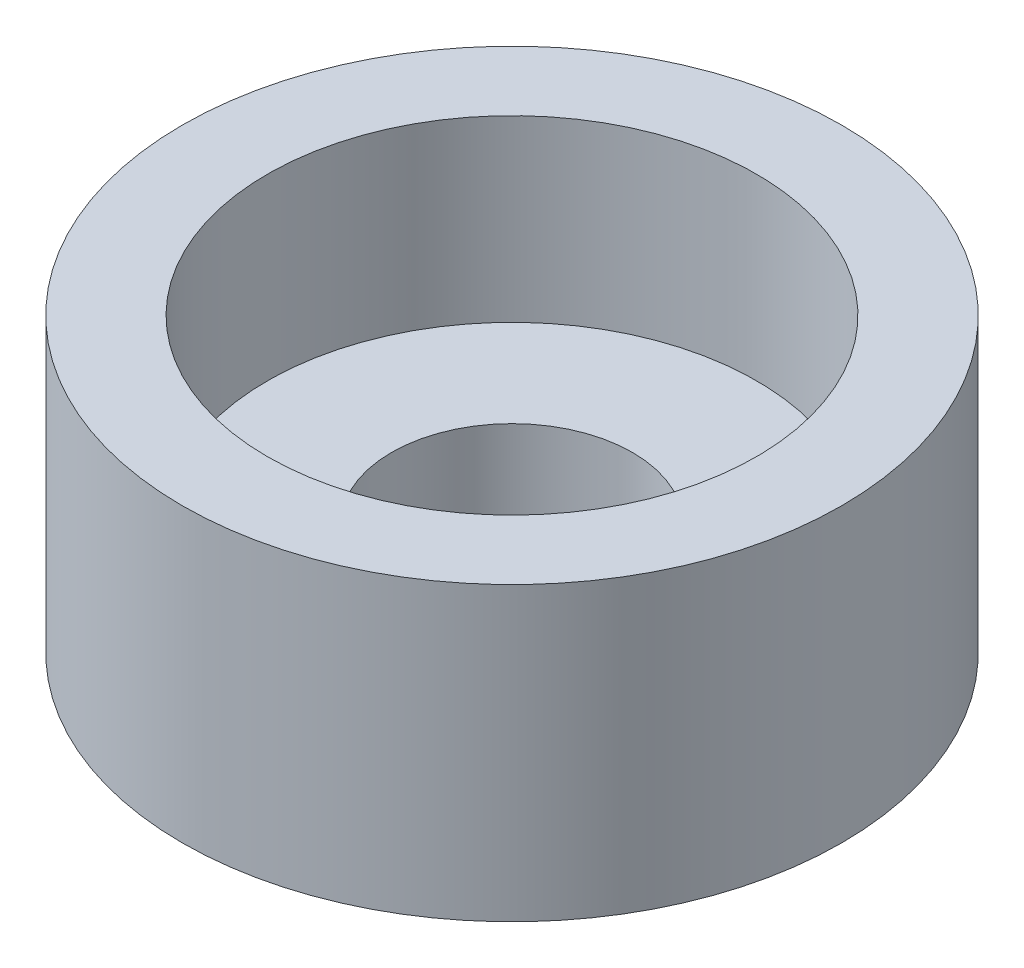
ISO-10303-21;
HEADER;
FILE_DESCRIPTION(('STEP AP214'),'2;1');
FILE_NAME('part.step','',(''),(''),'','','');
FILE_SCHEMA(('AUTOMOTIVE_DESIGN { 1 0 10303 214 1 1 1 1 }'));
ENDSEC;
DATA;
#1=APPLICATION_CONTEXT('core data for automotive mechanical design processes');
#2=APPLICATION_PROTOCOL_DEFINITION('international standard','automotive_design',2000,#1);
#3=PRODUCT_CONTEXT('',#1,'mechanical');
#4=PRODUCT('Part','Part','',(#3));
#5=PRODUCT_RELATED_PRODUCT_CATEGORY('part','',(#4));
#6=PRODUCT_DEFINITION_FORMATION('','',#4);
#7=PRODUCT_DEFINITION_CONTEXT('part definition',#1,'design');
#8=PRODUCT_DEFINITION('design','',#6,#7);
#9=PRODUCT_DEFINITION_SHAPE('','',#8);
#10=(LENGTH_UNIT() NAMED_UNIT(*) SI_UNIT(.MILLI.,.METRE.));
#11=(NAMED_UNIT(*) PLANE_ANGLE_UNIT() SI_UNIT($,.RADIAN.));
#12=(NAMED_UNIT(*) SI_UNIT($,.STERADIAN.) SOLID_ANGLE_UNIT());
#13=UNCERTAINTY_MEASURE_WITH_UNIT(LENGTH_MEASURE(1.E-05),#10,'distance_accuracy_value','');
#14=(GEOMETRIC_REPRESENTATION_CONTEXT(3) GLOBAL_UNCERTAINTY_ASSIGNED_CONTEXT((#13)) GLOBAL_UNIT_ASSIGNED_CONTEXT((#10,
#11,#12)) REPRESENTATION_CONTEXT('',''));
#15=CARTESIAN_POINT('',(0.,0.,0.));
#16=DIRECTION('',(0.,0.,1.));
#17=DIRECTION('',(1.,0.,0.));
#18=AXIS2_PLACEMENT_3D('',#15,#16,#17);
#19=CARTESIAN_POINT('',(0.,31.,0.));
#20=DIRECTION('',(0.,-1.,0.));
#21=DIRECTION('',(0.,0.,-1.));
#22=AXIS2_PLACEMENT_3D('',#19,#20,#21);
#23=CYLINDRICAL_SURFACE('',#22,12.8);
#24=CARTESIAN_POINT('',(0.,0.,0.));
#25=DIRECTION('',(0.,1.,0.));
#26=DIRECTION('',(0.,0.,1.));
#27=AXIS2_PLACEMENT_3D('',#24,#25,#26);
#28=CIRCLE('',#27,12.8);
#29=CARTESIAN_POINT('',(0.,0.,12.8));
#30=VERTEX_POINT('',#29);
#31=EDGE_CURVE('E58',#30,#30,#28,.T.);
#32=ORIENTED_EDGE('',*,*,#31,.F.);
#33=EDGE_LOOP('',(#32));
#34=FACE_BOUND('',#33,.T.);
#35=CARTESIAN_POINT('',(0.,12.,0.));
#36=DIRECTION('',(0.,1.,0.));
#37=DIRECTION('',(0.,0.,1.));
#38=AXIS2_PLACEMENT_3D('',#35,#36,#37);
#39=CIRCLE('',#38,12.8);
#40=CARTESIAN_POINT('',(0.,12.,12.8));
#41=VERTEX_POINT('',#40);
#42=EDGE_CURVE('E47',#41,#41,#39,.T.);
#43=ORIENTED_EDGE('',*,*,#42,.T.);
#44=EDGE_LOOP('',(#43));
#45=FACE_BOUND('',#44,.T.);
#46=ADVANCED_FACE('F43',(#34,#45),#23,.F.);
#47=CARTESIAN_POINT('',(0.,31.,0.));
#48=DIRECTION('',(0.,1.,0.));
#49=DIRECTION('',(0.,0.,1.));
#50=AXIS2_PLACEMENT_3D('',#47,#48,#49);
#51=PLANE('',#50);
#52=CARTESIAN_POINT('',(0.,31.,0.));
#53=DIRECTION('',(0.,1.,0.));
#54=DIRECTION('',(0.,0.,1.));
#55=AXIS2_PLACEMENT_3D('',#52,#53,#54);
#56=CIRCLE('',#55,25.97);
#57=CARTESIAN_POINT('',(0.,31.,25.97));
#58=VERTEX_POINT('',#57);
#59=EDGE_CURVE('E63',#58,#58,#56,.T.);
#60=ORIENTED_EDGE('',*,*,#59,.F.);
#61=EDGE_LOOP('',(#60));
#62=FACE_BOUND('',#61,.T.);
#63=CARTESIAN_POINT('',(0.,31.,0.));
#64=DIRECTION('',(0.,1.,0.));
#65=DIRECTION('',(0.,0.,1.));
#66=AXIS2_PLACEMENT_3D('',#63,#64,#65);
#67=CIRCLE('',#66,35.);
#68=CARTESIAN_POINT('',(0.,31.,35.));
#69=VERTEX_POINT('',#68);
#70=EDGE_CURVE('E10',#69,#69,#67,.T.);
#71=ORIENTED_EDGE('',*,*,#70,.T.);
#72=EDGE_LOOP('',(#71));
#73=FACE_BOUND('',#72,.T.);
#74=ADVANCED_FACE('F108',(#62,#73),#51,.T.);
#75=CARTESIAN_POINT('',(0.,0.,0.));
#76=DIRECTION('',(0.,1.,0.));
#77=DIRECTION('',(0.,0.,1.));
#78=AXIS2_PLACEMENT_3D('',#75,#76,#77);
#79=PLANE('',#78);
#80=CARTESIAN_POINT('',(-25.362762044836,0.,-1.37488234297628));
#81=DIRECTION('',(0.,-1.,0.));
#82=DIRECTION('',(0.,0.,-1.));
#83=AXIS2_PLACEMENT_3D('',#80,#81,#82);
#84=CIRCLE('',#83,3.025);
#85=CARTESIAN_POINT('',(-25.362762044836,0.,-4.39988234297628));
#86=VERTEX_POINT('',#85);
#87=EDGE_CURVE('E88',#86,#86,#84,.T.);
#88=ORIENTED_EDGE('',*,*,#87,.F.);
#89=EDGE_LOOP('',(#88));
#90=FACE_BOUND('',#89,.T.);
#91=CARTESIAN_POINT('',(11.4906979861859,0.,22.6522374124558));
#92=DIRECTION('',(0.,-1.,0.));
#93=DIRECTION('',(0.,0.,-1.));
#94=AXIS2_PLACEMENT_3D('',#91,#92,#93);
#95=CIRCLE('',#94,3.025);
#96=CARTESIAN_POINT('',(11.4906979861859,0.,19.6272374124558));
#97=VERTEX_POINT('',#96);
#98=EDGE_CURVE('E80',#97,#97,#95,.T.);
#99=ORIENTED_EDGE('',*,*,#98,.F.);
#100=EDGE_LOOP('',(#99));
#101=FACE_BOUND('',#100,.T.);
#102=CARTESIAN_POINT('',(13.87206405865,0.,-21.2773550694797));
#103=DIRECTION('',(0.,-1.,0.));
#104=DIRECTION('',(0.,0.,-1.));
#105=AXIS2_PLACEMENT_3D('',#102,#103,#104);
#106=CIRCLE('',#105,3.025);
#107=CARTESIAN_POINT('',(13.87206405865,0.,-24.3023550694797));
#108=VERTEX_POINT('',#107);
#109=EDGE_CURVE('E72',#108,#108,#106,.T.);
#110=ORIENTED_EDGE('',*,*,#109,.F.);
#111=EDGE_LOOP('',(#110));
#112=FACE_BOUND('',#111,.T.);
#113=CARTESIAN_POINT('',(0.,0.,0.));
#114=DIRECTION('',(0.,1.,0.));
#115=DIRECTION('',(0.,0.,1.));
#116=AXIS2_PLACEMENT_3D('',#113,#114,#115);
#117=CIRCLE('',#116,35.);
#118=CARTESIAN_POINT('',(0.,0.,35.));
#119=VERTEX_POINT('',#118);
#120=EDGE_CURVE('E52',#119,#119,#117,.T.);
#121=ORIENTED_EDGE('',*,*,#120,.F.);
#122=EDGE_LOOP('',(#121));
#123=FACE_BOUND('',#122,.T.);
#124=ORIENTED_EDGE('',*,*,#31,.T.);
#125=EDGE_LOOP('',(#124));
#126=FACE_BOUND('',#125,.T.);
#127=ADVANCED_FACE('F105',(#90,#101,#112,#123,#126),#79,.F.);
#128=CARTESIAN_POINT('',(0.,31.,0.));
#129=DIRECTION('',(0.,-1.,0.));
#130=DIRECTION('',(0.,0.,-1.));
#131=AXIS2_PLACEMENT_3D('',#128,#129,#130);
#132=CYLINDRICAL_SURFACE('',#131,35.);
#133=ORIENTED_EDGE('',*,*,#70,.F.);
#134=EDGE_LOOP('',(#133));
#135=FACE_BOUND('',#134,.T.);
#136=ORIENTED_EDGE('',*,*,#120,.T.);
#137=EDGE_LOOP('',(#136));
#138=FACE_BOUND('',#137,.T.);
#139=ADVANCED_FACE('F45',(#135,#138),#132,.T.);
#140=CARTESIAN_POINT('',(0.,12.,0.));
#141=DIRECTION('',(0.,1.,0.));
#142=DIRECTION('',(0.,0.,1.));
#143=AXIS2_PLACEMENT_3D('',#140,#141,#142);
#144=CYLINDRICAL_SURFACE('',#143,25.97);
#145=CARTESIAN_POINT('',(0.,12.,0.));
#146=DIRECTION('',(0.,1.,0.));
#147=DIRECTION('',(0.,0.,1.));
#148=AXIS2_PLACEMENT_3D('',#145,#146,#147);
#149=CIRCLE('',#148,25.97);
#150=CARTESIAN_POINT('',(0.,12.,25.97));
#151=VERTEX_POINT('',#150);
#152=EDGE_CURVE('E67',#151,#151,#149,.T.);
#153=ORIENTED_EDGE('',*,*,#152,.F.);
#154=EDGE_LOOP('',(#153));
#155=FACE_BOUND('',#154,.T.);
#156=ORIENTED_EDGE('',*,*,#59,.T.);
#157=EDGE_LOOP('',(#156));
#158=FACE_BOUND('',#157,.T.);
#159=ADVANCED_FACE('F128',(#155,#158),#144,.F.);
#160=CARTESIAN_POINT('',(0.,12.,0.));
#161=DIRECTION('',(0.,1.,0.));
#162=DIRECTION('',(0.,0.,1.));
#163=AXIS2_PLACEMENT_3D('',#160,#161,#162);
#164=PLANE('',#163);
#165=ORIENTED_EDGE('',*,*,#42,.F.);
#166=EDGE_LOOP('',(#165));
#167=FACE_BOUND('',#166,.T.);
#168=ORIENTED_EDGE('',*,*,#152,.T.);
#169=EDGE_LOOP('',(#168));
#170=FACE_BOUND('',#169,.T.);
#171=ADVANCED_FACE('F124',(#167,#170),#164,.T.);
#172=CARTESIAN_POINT('',(13.87206405865,5.1,-21.2773550694797));
#173=DIRECTION('',(0.,-1.,0.));
#174=DIRECTION('',(0.,0.,-1.));
#175=AXIS2_PLACEMENT_3D('',#172,#173,#174);
#176=CYLINDRICAL_SURFACE('',#175,3.025);
#177=CARTESIAN_POINT('',(13.87206405865,5.1,-21.2773550694797));
#178=DIRECTION('',(0.,-1.,0.));
#179=DIRECTION('',(0.,0.,-1.));
#180=AXIS2_PLACEMENT_3D('',#177,#178,#179);
#181=CIRCLE('',#180,3.025);
#182=CARTESIAN_POINT('',(13.87206405865,5.1,-24.3023550694797));
#183=VERTEX_POINT('',#182);
#184=EDGE_CURVE('E76',#183,#183,#181,.T.);
#185=ORIENTED_EDGE('',*,*,#184,.F.);
#186=EDGE_LOOP('',(#185));
#187=FACE_BOUND('',#186,.T.);
#188=ORIENTED_EDGE('',*,*,#109,.T.);
#189=EDGE_LOOP('',(#188));
#190=FACE_BOUND('',#189,.T.);
#191=ADVANCED_FACE('F127',(#187,#190),#176,.F.);
#192=CARTESIAN_POINT('',(0.,5.1,0.));
#193=DIRECTION('',(0.,-1.,0.));
#194=DIRECTION('',(0.,0.,-1.));
#195=AXIS2_PLACEMENT_3D('',#192,#193,#194);
#196=PLANE('',#195);
#197=ORIENTED_EDGE('',*,*,#184,.T.);
#198=EDGE_LOOP('',(#197));
#199=FACE_BOUND('',#198,.T.);
#200=ADVANCED_FACE('F144',(#199),#196,.T.);
#201=CARTESIAN_POINT('',(11.4906979861859,5.1,22.6522374124558));
#202=DIRECTION('',(0.,-1.,0.));
#203=DIRECTION('',(0.,0.,-1.));
#204=AXIS2_PLACEMENT_3D('',#201,#202,#203);
#205=CYLINDRICAL_SURFACE('',#204,3.025);
#206=CARTESIAN_POINT('',(11.4906979861859,5.1,22.6522374124558));
#207=DIRECTION('',(0.,-1.,0.));
#208=DIRECTION('',(0.,0.,-1.));
#209=AXIS2_PLACEMENT_3D('',#206,#207,#208);
#210=CIRCLE('',#209,3.025);
#211=CARTESIAN_POINT('',(11.4906979861859,5.1,19.6272374124558));
#212=VERTEX_POINT('',#211);
#213=EDGE_CURVE('E84',#212,#212,#210,.T.);
#214=ORIENTED_EDGE('',*,*,#213,.F.);
#215=EDGE_LOOP('',(#214));
#216=FACE_BOUND('',#215,.T.);
#217=ORIENTED_EDGE('',*,*,#98,.T.);
#218=EDGE_LOOP('',(#217));
#219=FACE_BOUND('',#218,.T.);
#220=ADVANCED_FACE('F148',(#216,#219),#205,.F.);
#221=CARTESIAN_POINT('',(0.,5.1,0.));
#222=DIRECTION('',(0.,-1.,0.));
#223=DIRECTION('',(0.,0.,-1.));
#224=AXIS2_PLACEMENT_3D('',#221,#222,#223);
#225=PLANE('',#224);
#226=ORIENTED_EDGE('',*,*,#213,.T.);
#227=EDGE_LOOP('',(#226));
#228=FACE_BOUND('',#227,.T.);
#229=ADVANCED_FACE('F101',(#228),#225,.T.);
#230=CARTESIAN_POINT('',(-25.362762044836,5.1,-1.37488234297628));
#231=DIRECTION('',(0.,-1.,0.));
#232=DIRECTION('',(0.,0.,-1.));
#233=AXIS2_PLACEMENT_3D('',#230,#231,#232);
#234=CYLINDRICAL_SURFACE('',#233,3.025);
#235=CARTESIAN_POINT('',(-25.362762044836,5.1,-1.37488234297628));
#236=DIRECTION('',(0.,-1.,0.));
#237=DIRECTION('',(0.,0.,-1.));
#238=AXIS2_PLACEMENT_3D('',#235,#236,#237);
#239=CIRCLE('',#238,3.025);
#240=CARTESIAN_POINT('',(-25.362762044836,5.1,-4.39988234297628));
#241=VERTEX_POINT('',#240);
#242=EDGE_CURVE('E68',#241,#241,#239,.T.);
#243=ORIENTED_EDGE('',*,*,#242,.F.);
#244=EDGE_LOOP('',(#243));
#245=FACE_BOUND('',#244,.T.);
#246=ORIENTED_EDGE('',*,*,#87,.T.);
#247=EDGE_LOOP('',(#246));
#248=FACE_BOUND('',#247,.T.);
#249=ADVANCED_FACE('F98',(#245,#248),#234,.F.);
#250=CARTESIAN_POINT('',(0.,5.1,0.));
#251=DIRECTION('',(0.,-1.,0.));
#252=DIRECTION('',(0.,0.,-1.));
#253=AXIS2_PLACEMENT_3D('',#250,#251,#252);
#254=PLANE('',#253);
#255=ORIENTED_EDGE('',*,*,#242,.T.);
#256=EDGE_LOOP('',(#255));
#257=FACE_BOUND('',#256,.T.);
#258=ADVANCED_FACE('F96',(#257),#254,.T.);
#259=CLOSED_SHELL('',(#46,#74,#127,#139,#159,#171,#191,#200,#220,#229,#249,#258));
#260=MANIFOLD_SOLID_BREP('B2',#259);
#261=ADVANCED_BREP_SHAPE_REPRESENTATION('',(#18,#260),#14);
#262=SHAPE_DEFINITION_REPRESENTATION(#9,#261);
ENDSEC;
END-ISO-10303-21;
